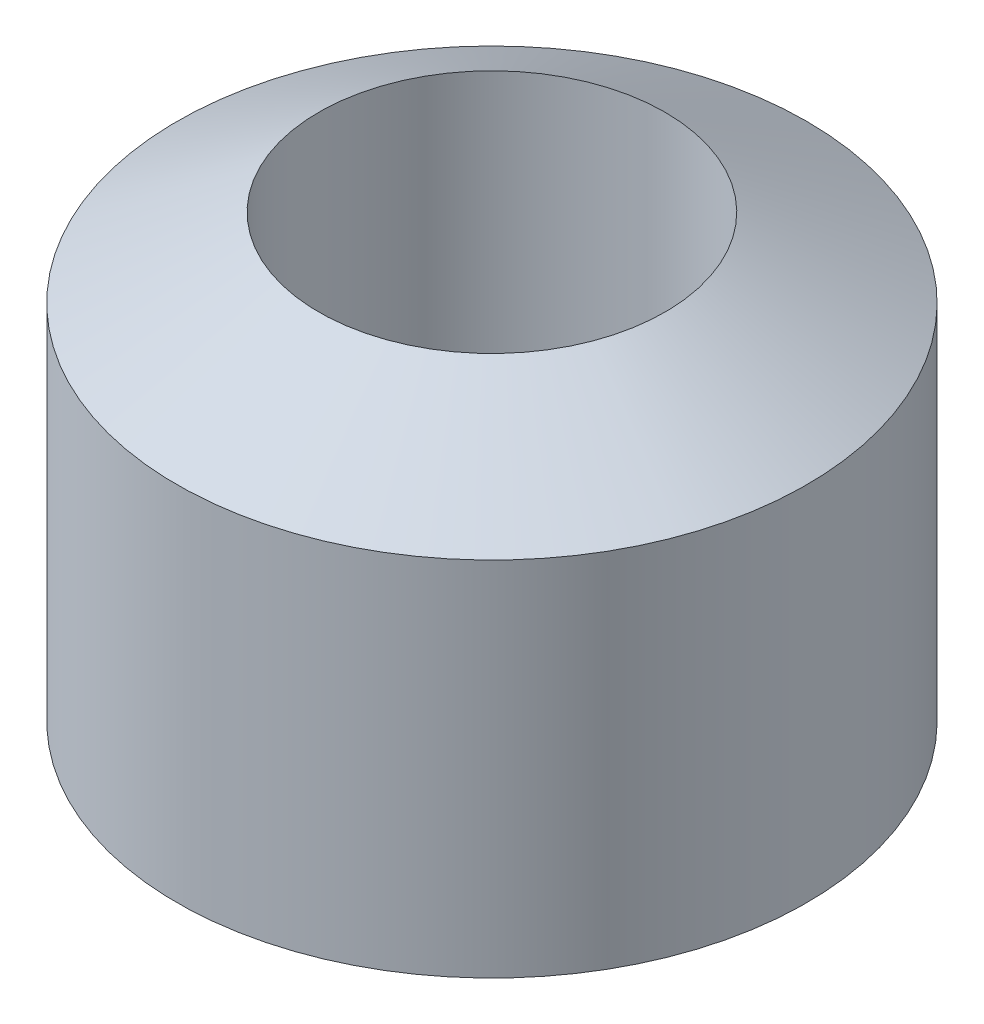
ISO-10303-21;
HEADER;
FILE_DESCRIPTION(('STEP AP214'),'2;1');
FILE_NAME('part.step','',(''),(''),'','','');
FILE_SCHEMA(('AUTOMOTIVE_DESIGN { 1 0 10303 214 1 1 1 1 }'));
ENDSEC;
DATA;
#1=APPLICATION_CONTEXT('core data for automotive mechanical design processes');
#2=APPLICATION_PROTOCOL_DEFINITION('international standard','automotive_design',2000,#1);
#3=PRODUCT_CONTEXT('',#1,'mechanical');
#4=PRODUCT('Part','Part','',(#3));
#5=PRODUCT_RELATED_PRODUCT_CATEGORY('part','',(#4));
#6=PRODUCT_DEFINITION_FORMATION('','',#4);
#7=PRODUCT_DEFINITION_CONTEXT('part definition',#1,'design');
#8=PRODUCT_DEFINITION('design','',#6,#7);
#9=PRODUCT_DEFINITION_SHAPE('','',#8);
#10=(LENGTH_UNIT() NAMED_UNIT(*) SI_UNIT(.MILLI.,.METRE.));
#11=(NAMED_UNIT(*) PLANE_ANGLE_UNIT() SI_UNIT($,.RADIAN.));
#12=(NAMED_UNIT(*) SI_UNIT($,.STERADIAN.) SOLID_ANGLE_UNIT());
#13=UNCERTAINTY_MEASURE_WITH_UNIT(LENGTH_MEASURE(1.E-05),#10,'distance_accuracy_value','');
#14=(GEOMETRIC_REPRESENTATION_CONTEXT(3) GLOBAL_UNCERTAINTY_ASSIGNED_CONTEXT((#13)) GLOBAL_UNIT_ASSIGNED_CONTEXT((#10,
#11,#12)) REPRESENTATION_CONTEXT('',''));
#15=CARTESIAN_POINT('',(0.,0.,0.));
#16=DIRECTION('',(0.,0.,1.));
#17=DIRECTION('',(1.,0.,0.));
#18=AXIS2_PLACEMENT_3D('',#15,#16,#17);
#19=CARTESIAN_POINT('',(0.,0.,0.));
#20=DIRECTION('',(0.,-1.,0.));
#21=DIRECTION('',(0.,0.,-1.));
#22=AXIS2_PLACEMENT_3D('',#19,#20,#21);
#23=CYLINDRICAL_SURFACE('',#22,5.5);
#24=CARTESIAN_POINT('',(0.,0.,0.));
#25=DIRECTION('',(0.,-1.,0.));
#26=DIRECTION('',(0.,0.,-1.));
#27=AXIS2_PLACEMENT_3D('',#24,#25,#26);
#28=CIRCLE('',#27,5.5);
#29=CARTESIAN_POINT('',(0.,0.,-5.5));
#30=VERTEX_POINT('',#29);
#31=EDGE_CURVE('E10',#30,#30,#28,.T.);
#32=ORIENTED_EDGE('',*,*,#31,.T.);
#33=EDGE_LOOP('',(#32));
#34=FACE_BOUND('',#33,.T.);
#35=CARTESIAN_POINT('',(0.,16.5,0.));
#36=DIRECTION('',(0.,-1.,0.));
#37=DIRECTION('',(0.,0.,-1.));
#38=AXIS2_PLACEMENT_3D('',#35,#36,#37);
#39=CIRCLE('',#38,5.5);
#40=CARTESIAN_POINT('',(0.,16.5,-5.5));
#41=VERTEX_POINT('',#40);
#42=EDGE_CURVE('E44',#41,#41,#39,.T.);
#43=ORIENTED_EDGE('',*,*,#42,.F.);
#44=EDGE_LOOP('',(#43));
#45=FACE_BOUND('',#44,.T.);
#46=ADVANCED_FACE('F30',(#34,#45),#23,.F.);
#47=CARTESIAN_POINT('',(0.,0.,0.));
#48=DIRECTION('',(0.,1.,0.));
#49=DIRECTION('',(0.,0.,1.));
#50=AXIS2_PLACEMENT_3D('',#47,#48,#49);
#51=CONICAL_SURFACE('',#50,5.5,1.06369782240256);
#52=CARTESIAN_POINT('',(0.,2.5,0.));
#53=DIRECTION('',(0.,-1.,0.));
#54=DIRECTION('',(0.,0.,-1.));
#55=AXIS2_PLACEMENT_3D('',#52,#53,#54);
#56=CIRCLE('',#55,10.);
#57=CARTESIAN_POINT('',(0.,2.5,-10.));
#58=VERTEX_POINT('',#57);
#59=EDGE_CURVE('E36',#58,#58,#56,.T.);
#60=ORIENTED_EDGE('',*,*,#59,.T.);
#61=EDGE_LOOP('',(#60));
#62=FACE_BOUND('',#61,.T.);
#63=ORIENTED_EDGE('',*,*,#31,.F.);
#64=EDGE_LOOP('',(#63));
#65=FACE_BOUND('',#64,.T.);
#66=ADVANCED_FACE('F54',(#62,#65),#51,.T.);
#67=CARTESIAN_POINT('',(0.,0.,0.));
#68=DIRECTION('',(0.,-1.,0.));
#69=DIRECTION('',(0.,0.,-1.));
#70=AXIS2_PLACEMENT_3D('',#67,#68,#69);
#71=CYLINDRICAL_SURFACE('',#70,10.);
#72=CARTESIAN_POINT('',(0.,14.,0.));
#73=DIRECTION('',(0.,-1.,0.));
#74=DIRECTION('',(0.,0.,-1.));
#75=AXIS2_PLACEMENT_3D('',#72,#73,#74);
#76=CIRCLE('',#75,10.);
#77=CARTESIAN_POINT('',(0.,14.,-10.));
#78=VERTEX_POINT('',#77);
#79=EDGE_CURVE('E40',#78,#78,#76,.T.);
#80=ORIENTED_EDGE('',*,*,#79,.T.);
#81=EDGE_LOOP('',(#80));
#82=FACE_BOUND('',#81,.T.);
#83=ORIENTED_EDGE('',*,*,#59,.F.);
#84=EDGE_LOOP('',(#83));
#85=FACE_BOUND('',#84,.T.);
#86=ADVANCED_FACE('F58',(#82,#85),#71,.T.);
#87=CARTESIAN_POINT('',(0.,14.,0.));
#88=DIRECTION('',(0.,-1.,0.));
#89=DIRECTION('',(0.,0.,-1.));
#90=AXIS2_PLACEMENT_3D('',#87,#88,#89);
#91=CONICAL_SURFACE('',#90,10.,1.06369782240256);
#92=ORIENTED_EDGE('',*,*,#42,.T.);
#93=EDGE_LOOP('',(#92));
#94=FACE_BOUND('',#93,.T.);
#95=ORIENTED_EDGE('',*,*,#79,.F.);
#96=EDGE_LOOP('',(#95));
#97=FACE_BOUND('',#96,.T.);
#98=ADVANCED_FACE('F50',(#94,#97),#91,.T.);
#99=CLOSED_SHELL('',(#46,#66,#86,#98));
#100=MANIFOLD_SOLID_BREP('B2',#99);
#101=ADVANCED_BREP_SHAPE_REPRESENTATION('',(#18,#100),#14);
#102=SHAPE_DEFINITION_REPRESENTATION(#9,#101);
ENDSEC;
END-ISO-10303-21;
